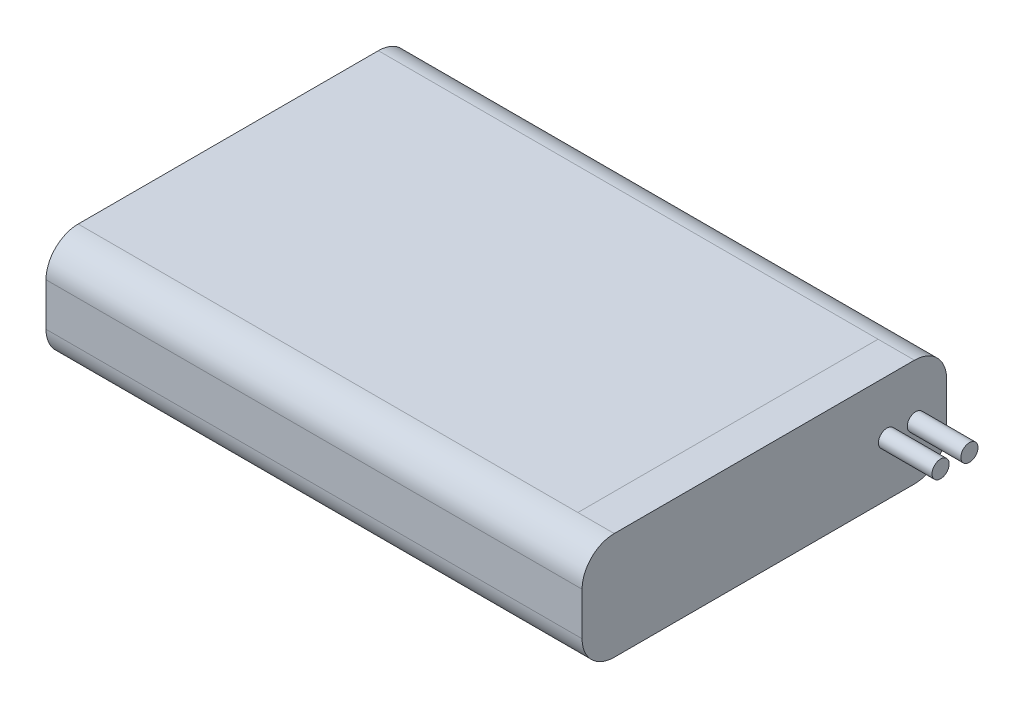
ISO-10303-21;
HEADER;
FILE_DESCRIPTION(('STEP AP214'),'2;1');
FILE_NAME('part.step','',(''),(''),'','','');
FILE_SCHEMA(('AUTOMOTIVE_DESIGN { 1 0 10303 214 1 1 1 1 }'));
ENDSEC;
DATA;
#1=APPLICATION_CONTEXT('core data for automotive mechanical design processes');
#2=APPLICATION_PROTOCOL_DEFINITION('international standard','automotive_design',2000,#1);
#3=PRODUCT_CONTEXT('',#1,'mechanical');
#4=PRODUCT('Part','Part','',(#3));
#5=PRODUCT_RELATED_PRODUCT_CATEGORY('part','',(#4));
#6=PRODUCT_DEFINITION_FORMATION('','',#4);
#7=PRODUCT_DEFINITION_CONTEXT('part definition',#1,'design');
#8=PRODUCT_DEFINITION('design','',#6,#7);
#9=PRODUCT_DEFINITION_SHAPE('','',#8);
#10=(LENGTH_UNIT() NAMED_UNIT(*) SI_UNIT(.MILLI.,.METRE.));
#11=(NAMED_UNIT(*) PLANE_ANGLE_UNIT() SI_UNIT($,.RADIAN.));
#12=(NAMED_UNIT(*) SI_UNIT($,.STERADIAN.) SOLID_ANGLE_UNIT());
#13=UNCERTAINTY_MEASURE_WITH_UNIT(LENGTH_MEASURE(1.E-05),#10,'distance_accuracy_value','');
#14=(GEOMETRIC_REPRESENTATION_CONTEXT(3) GLOBAL_UNCERTAINTY_ASSIGNED_CONTEXT((#13)) GLOBAL_UNIT_ASSIGNED_CONTEXT((#10,
#11,#12)) REPRESENTATION_CONTEXT('',''));
#15=CARTESIAN_POINT('',(0.,0.,0.));
#16=DIRECTION('',(0.,0.,1.));
#17=DIRECTION('',(1.,0.,0.));
#18=AXIS2_PLACEMENT_3D('',#15,#16,#17);
#19=CARTESIAN_POINT('',(50.,-5.28206765436695,13.8102105701798));
#20=DIRECTION('',(0.,1.,0.));
#21=DIRECTION('',(0.,0.,1.));
#22=AXIS2_PLACEMENT_3D('',#19,#20,#21);
#23=PLANE('',#22);
#24=DIRECTION('',(0.,0.,-1.));
#25=VECTOR('',#24,1.);
#26=CARTESIAN_POINT('',(46.6086278265007,-5.28206765436695,13.8102105701798));
#27=LINE('',#26,#25);
#28=CARTESIAN_POINT('',(46.6086278265007,-5.28206765436695,13.8102105701798));
#29=VERTEX_POINT('',#28);
#30=CARTESIAN_POINT('',(46.6086278265007,-5.28206765436695,-14.1897894298202));
#31=VERTEX_POINT('',#30);
#32=EDGE_CURVE('E395',#29,#31,#27,.T.);
#33=ORIENTED_EDGE('',*,*,#32,.F.);
#34=DIRECTION('',(-1.,0.,0.));
#35=VECTOR('',#34,1.);
#36=CARTESIAN_POINT('',(50.,-5.28206765436695,13.8102105701798));
#37=LINE('',#36,#35);
#38=CARTESIAN_POINT('',(0.,-5.28206765436695,13.8102105701798));
#39=VERTEX_POINT('',#38);
#40=EDGE_CURVE('E177',#29,#39,#37,.T.);
#41=ORIENTED_EDGE('',*,*,#40,.T.);
#42=DIRECTION('',(0.,0.,-1.));
#43=VECTOR('',#42,1.);
#44=CARTESIAN_POINT('',(0.,-5.28206765436695,13.8102105701798));
#45=LINE('',#44,#43);
#46=CARTESIAN_POINT('',(0.,-5.28206765436695,-14.1897894298202));
#47=VERTEX_POINT('',#46);
#48=EDGE_CURVE('E145',#39,#47,#45,.T.);
#49=ORIENTED_EDGE('',*,*,#48,.T.);
#50=DIRECTION('',(-1.,0.,0.));
#51=VECTOR('',#50,1.);
#52=CARTESIAN_POINT('',(50.,-5.28206765436695,-14.1897894298202));
#53=LINE('',#52,#51);
#54=EDGE_CURVE('E173',#31,#47,#53,.T.);
#55=ORIENTED_EDGE('',*,*,#54,.F.);
#56=EDGE_LOOP('',(#33,#41,#49,#55));
#57=FACE_BOUND('',#56,.T.);
#58=ADVANCED_FACE('F37',(#57),#23,.F.);
#59=CARTESIAN_POINT('',(50.,4.71793234563305,13.8102105701798));
#60=DIRECTION('',(0.,-1.,0.));
#61=DIRECTION('',(0.,0.,-1.));
#62=AXIS2_PLACEMENT_3D('',#59,#60,#61);
#63=PLANE('',#62);
#64=DIRECTION('',(0.,0.,1.));
#65=VECTOR('',#64,1.);
#66=CARTESIAN_POINT('',(46.6086278265007,4.71793234563305,-14.1897894298202));
#67=LINE('',#66,#65);
#68=CARTESIAN_POINT('',(46.6086278265007,4.71793234563305,-14.1897894298202));
#69=VERTEX_POINT('',#68);
#70=CARTESIAN_POINT('',(46.6086278265007,4.71793234563305,13.8102105701798));
#71=VERTEX_POINT('',#70);
#72=EDGE_CURVE('E370',#69,#71,#67,.T.);
#73=ORIENTED_EDGE('',*,*,#72,.F.);
#74=DIRECTION('',(-1.,0.,0.));
#75=VECTOR('',#74,1.);
#76=CARTESIAN_POINT('',(50.,4.71793234563305,-14.1897894298202));
#77=LINE('',#76,#75);
#78=CARTESIAN_POINT('',(0.,4.71793234563305,-14.1897894298202));
#79=VERTEX_POINT('',#78);
#80=EDGE_CURVE('E128',#69,#79,#77,.T.);
#81=ORIENTED_EDGE('',*,*,#80,.T.);
#82=DIRECTION('',(0.,0.,1.));
#83=VECTOR('',#82,1.);
#84=CARTESIAN_POINT('',(0.,4.71793234563305,13.8102105701798));
#85=LINE('',#84,#83);
#86=CARTESIAN_POINT('',(0.,4.71793234563305,13.8102105701798));
#87=VERTEX_POINT('',#86);
#88=EDGE_CURVE('E156',#79,#87,#85,.T.);
#89=ORIENTED_EDGE('',*,*,#88,.T.);
#90=DIRECTION('',(-1.,0.,0.));
#91=VECTOR('',#90,1.);
#92=CARTESIAN_POINT('',(50.,4.71793234563305,13.8102105701798));
#93=LINE('',#92,#91);
#94=EDGE_CURVE('E129',#71,#87,#93,.T.);
#95=ORIENTED_EDGE('',*,*,#94,.F.);
#96=EDGE_LOOP('',(#73,#81,#89,#95));
#97=FACE_BOUND('',#96,.T.);
#98=ADVANCED_FACE('F200',(#97),#63,.F.);
#99=CARTESIAN_POINT('',(50.,-2.28206765436695,13.8102105701798));
#100=DIRECTION('',(-1.,0.,0.));
#101=DIRECTION('',(0.,0.,1.));
#102=AXIS2_PLACEMENT_3D('',#99,#100,#101);
#103=CYLINDRICAL_SURFACE('',#102,3.);
#104=CARTESIAN_POINT('',(0.,-2.28206765436695,13.8102105701798));
#105=DIRECTION('',(1.,0.,0.));
#106=DIRECTION('',(0.,0.,1.));
#107=AXIS2_PLACEMENT_3D('',#104,#105,#106);
#108=CIRCLE('',#107,3.);
#109=CARTESIAN_POINT('',(0.,-2.28206765436693,16.8102105701798));
#110=VERTEX_POINT('',#109);
#111=EDGE_CURVE('E142',#110,#39,#108,.T.);
#112=ORIENTED_EDGE('',*,*,#111,.T.);
#113=ORIENTED_EDGE('',*,*,#40,.F.);
#114=CARTESIAN_POINT('',(50.,-5.28206765436695,13.8102105701798));
#115=VERTEX_POINT('',#114);
#116=EDGE_CURVE('E178',#115,#29,#37,.T.);
#117=ORIENTED_EDGE('',*,*,#116,.F.);
#118=CARTESIAN_POINT('',(50.,-2.28206765436695,13.8102105701798));
#119=DIRECTION('',(1.,0.,0.));
#120=DIRECTION('',(0.,0.,1.));
#121=AXIS2_PLACEMENT_3D('',#118,#119,#120);
#122=CIRCLE('',#121,3.);
#123=CARTESIAN_POINT('',(50.,-2.28206765436693,16.8102105701798));
#124=VERTEX_POINT('',#123);
#125=EDGE_CURVE('E161',#124,#115,#122,.T.);
#126=ORIENTED_EDGE('',*,*,#125,.F.);
#127=DIRECTION('',(-1.,0.,0.));
#128=VECTOR('',#127,1.);
#129=CARTESIAN_POINT('',(50.,-2.28206765436693,16.8102105701798));
#130=LINE('',#129,#128);
#131=EDGE_CURVE('E135',#124,#110,#130,.T.);
#132=ORIENTED_EDGE('',*,*,#131,.T.);
#133=EDGE_LOOP('',(#112,#113,#117,#126,#132));
#134=FACE_BOUND('',#133,.T.);
#135=ADVANCED_FACE('F39',(#134),#103,.T.);
#136=CARTESIAN_POINT('',(50.,-2.28206765436695,-14.1897894298202));
#137=DIRECTION('',(-1.,0.,0.));
#138=DIRECTION('',(0.,0.,1.));
#139=AXIS2_PLACEMENT_3D('',#136,#137,#138);
#140=CYLINDRICAL_SURFACE('',#139,3.);
#141=CARTESIAN_POINT('',(0.,-2.28206765436695,-14.1897894298202));
#142=DIRECTION('',(1.,0.,0.));
#143=DIRECTION('',(0.,0.,-1.));
#144=AXIS2_PLACEMENT_3D('',#141,#142,#143);
#145=CIRCLE('',#144,3.);
#146=CARTESIAN_POINT('',(0.,-2.28206765436695,-17.1897894298202));
#147=VERTEX_POINT('',#146);
#148=EDGE_CURVE('E149',#47,#147,#145,.T.);
#149=ORIENTED_EDGE('',*,*,#148,.T.);
#150=DIRECTION('',(-1.,0.,0.));
#151=VECTOR('',#150,1.);
#152=CARTESIAN_POINT('',(50.,-2.28206765436695,-17.1897894298202));
#153=LINE('',#152,#151);
#154=CARTESIAN_POINT('',(50.,-2.28206765436695,-17.1897894298202));
#155=VERTEX_POINT('',#154);
#156=EDGE_CURVE('E170',#155,#147,#153,.T.);
#157=ORIENTED_EDGE('',*,*,#156,.F.);
#158=CARTESIAN_POINT('',(50.,-2.28206765436695,-14.1897894298202));
#159=DIRECTION('',(1.,0.,0.));
#160=DIRECTION('',(0.,0.,-1.));
#161=AXIS2_PLACEMENT_3D('',#158,#159,#160);
#162=CIRCLE('',#161,3.);
#163=CARTESIAN_POINT('',(50.,-5.28206765436695,-14.1897894298202));
#164=VERTEX_POINT('',#163);
#165=EDGE_CURVE('E347',#164,#155,#162,.T.);
#166=ORIENTED_EDGE('',*,*,#165,.F.);
#167=EDGE_CURVE('E174',#164,#31,#53,.T.);
#168=ORIENTED_EDGE('',*,*,#167,.T.);
#169=ORIENTED_EDGE('',*,*,#54,.T.);
#170=EDGE_LOOP('',(#149,#157,#166,#168,#169));
#171=FACE_BOUND('',#170,.T.);
#172=ADVANCED_FACE('F209',(#171),#140,.T.);
#173=CARTESIAN_POINT('',(50.,-2.28206765436693,-17.1897894298202));
#174=DIRECTION('',(0.,0.,1.));
#175=DIRECTION('',(1.,0.,0.));
#176=AXIS2_PLACEMENT_3D('',#173,#174,#175);
#177=PLANE('',#176);
#178=DIRECTION('',(0.,1.,0.));
#179=VECTOR('',#178,1.);
#180=CARTESIAN_POINT('',(0.,-2.28206765436693,-17.1897894298202));
#181=LINE('',#180,#179);
#182=CARTESIAN_POINT('',(0.,1.71793234563303,-17.1897894298202));
#183=VERTEX_POINT('',#182);
#184=EDGE_CURVE('E151',#147,#183,#181,.T.);
#185=ORIENTED_EDGE('',*,*,#184,.T.);
#186=DIRECTION('',(-1.,0.,0.));
#187=VECTOR('',#186,1.);
#188=CARTESIAN_POINT('',(50.,1.71793234563303,-17.1897894298202));
#189=LINE('',#188,#187);
#190=CARTESIAN_POINT('',(50.,1.71793234563303,-17.1897894298202));
#191=VERTEX_POINT('',#190);
#192=EDGE_CURVE('E167',#191,#183,#189,.T.);
#193=ORIENTED_EDGE('',*,*,#192,.F.);
#194=DIRECTION('',(0.,1.,0.));
#195=VECTOR('',#194,1.);
#196=CARTESIAN_POINT('',(50.,-2.28206765436693,-17.1897894298202));
#197=LINE('',#196,#195);
#198=EDGE_CURVE('E138',#155,#191,#197,.T.);
#199=ORIENTED_EDGE('',*,*,#198,.F.);
#200=ORIENTED_EDGE('',*,*,#156,.T.);
#201=EDGE_LOOP('',(#185,#193,#199,#200));
#202=FACE_BOUND('',#201,.T.);
#203=ADVANCED_FACE('F212',(#202),#177,.F.);
#204=CARTESIAN_POINT('',(50.,1.71793234563305,-14.1897894298202));
#205=DIRECTION('',(-1.,0.,0.));
#206=DIRECTION('',(0.,0.,1.));
#207=AXIS2_PLACEMENT_3D('',#204,#205,#206);
#208=CYLINDRICAL_SURFACE('',#207,3.);
#209=CARTESIAN_POINT('',(0.,1.71793234563305,-14.1897894298202));
#210=DIRECTION('',(1.,0.,0.));
#211=DIRECTION('',(0.,0.,1.));
#212=AXIS2_PLACEMENT_3D('',#209,#210,#211);
#213=CIRCLE('',#212,3.);
#214=EDGE_CURVE('E153',#183,#79,#213,.T.);
#215=ORIENTED_EDGE('',*,*,#214,.T.);
#216=ORIENTED_EDGE('',*,*,#80,.F.);
#217=CARTESIAN_POINT('',(50.,4.71793234563305,-14.1897894298202));
#218=VERTEX_POINT('',#217);
#219=EDGE_CURVE('E164',#218,#69,#77,.T.);
#220=ORIENTED_EDGE('',*,*,#219,.F.);
#221=CARTESIAN_POINT('',(50.,1.71793234563305,-14.1897894298202));
#222=DIRECTION('',(1.,0.,0.));
#223=DIRECTION('',(0.,0.,1.));
#224=AXIS2_PLACEMENT_3D('',#221,#222,#223);
#225=CIRCLE('',#224,3.);
#226=EDGE_CURVE('E133',#191,#218,#225,.T.);
#227=ORIENTED_EDGE('',*,*,#226,.F.);
#228=ORIENTED_EDGE('',*,*,#192,.T.);
#229=EDGE_LOOP('',(#215,#216,#220,#227,#228));
#230=FACE_BOUND('',#229,.T.);
#231=ADVANCED_FACE('F216',(#230),#208,.T.);
#232=CARTESIAN_POINT('',(50.,1.71793234563305,13.8102105701798));
#233=DIRECTION('',(-1.,0.,0.));
#234=DIRECTION('',(0.,0.,1.));
#235=AXIS2_PLACEMENT_3D('',#232,#233,#234);
#236=CYLINDRICAL_SURFACE('',#235,3.);
#237=CARTESIAN_POINT('',(0.,1.71793234563305,13.8102105701798));
#238=DIRECTION('',(1.,0.,0.));
#239=DIRECTION('',(0.,0.,1.));
#240=AXIS2_PLACEMENT_3D('',#237,#238,#239);
#241=CIRCLE('',#240,3.);
#242=CARTESIAN_POINT('',(0.,1.71793234563303,16.8102105701798));
#243=VERTEX_POINT('',#242);
#244=EDGE_CURVE('E83',#87,#243,#241,.T.);
#245=ORIENTED_EDGE('',*,*,#244,.T.);
#246=DIRECTION('',(-1.,0.,0.));
#247=VECTOR('',#246,1.);
#248=CARTESIAN_POINT('',(50.,1.71793234563303,16.8102105701798));
#249=LINE('',#248,#247);
#250=CARTESIAN_POINT('',(50.,1.71793234563303,16.8102105701798));
#251=VERTEX_POINT('',#250);
#252=EDGE_CURVE('E132',#251,#243,#249,.T.);
#253=ORIENTED_EDGE('',*,*,#252,.F.);
#254=CARTESIAN_POINT('',(50.,1.71793234563305,13.8102105701798));
#255=DIRECTION('',(1.,0.,0.));
#256=DIRECTION('',(0.,0.,1.));
#257=AXIS2_PLACEMENT_3D('',#254,#255,#256);
#258=CIRCLE('',#257,3.);
#259=CARTESIAN_POINT('',(50.,4.71793234563305,13.8102105701798));
#260=VERTEX_POINT('',#259);
#261=EDGE_CURVE('E113',#260,#251,#258,.T.);
#262=ORIENTED_EDGE('',*,*,#261,.F.);
#263=EDGE_CURVE('E124',#260,#71,#93,.T.);
#264=ORIENTED_EDGE('',*,*,#263,.T.);
#265=ORIENTED_EDGE('',*,*,#94,.T.);
#266=EDGE_LOOP('',(#245,#253,#262,#264,#265));
#267=FACE_BOUND('',#266,.T.);
#268=ADVANCED_FACE('F131',(#267),#236,.T.);
#269=CARTESIAN_POINT('',(50.,-2.28206765436693,16.8102105701798));
#270=DIRECTION('',(0.,0.,-1.));
#271=DIRECTION('',(-1.,0.,0.));
#272=AXIS2_PLACEMENT_3D('',#269,#270,#271);
#273=PLANE('',#272);
#274=DIRECTION('',(0.,-1.,0.));
#275=VECTOR('',#274,1.);
#276=CARTESIAN_POINT('',(0.,-2.28206765436693,16.8102105701798));
#277=LINE('',#276,#275);
#278=EDGE_CURVE('E89',#243,#110,#277,.T.);
#279=ORIENTED_EDGE('',*,*,#278,.T.);
#280=ORIENTED_EDGE('',*,*,#131,.F.);
#281=DIRECTION('',(0.,-1.,0.));
#282=VECTOR('',#281,1.);
#283=CARTESIAN_POINT('',(50.,-2.28206765436693,16.8102105701798));
#284=LINE('',#283,#282);
#285=EDGE_CURVE('E54',#251,#124,#284,.T.);
#286=ORIENTED_EDGE('',*,*,#285,.F.);
#287=ORIENTED_EDGE('',*,*,#252,.T.);
#288=EDGE_LOOP('',(#279,#280,#286,#287));
#289=FACE_BOUND('',#288,.T.);
#290=ADVANCED_FACE('F187',(#289),#273,.F.);
#291=CARTESIAN_POINT('',(50.,-2.28206765436695,13.8102105701798));
#292=DIRECTION('',(-1.,0.,0.));
#293=DIRECTION('',(0.,0.,1.));
#294=AXIS2_PLACEMENT_3D('',#291,#292,#293);
#295=PLANE('',#294);
#296=CARTESIAN_POINT('',(50.,-0.301594572683894,-14.3177603057034));
#297=DIRECTION('',(-1.,0.,0.));
#298=DIRECTION('',(0.,0.,1.));
#299=AXIS2_PLACEMENT_3D('',#296,#297,#298);
#300=CIRCLE('',#299,0.800000000000001);
#301=CARTESIAN_POINT('',(50.,-0.301594572683894,-13.5177603057034));
#302=VERTEX_POINT('',#301);
#303=EDGE_CURVE('E11',#302,#302,#300,.F.);
#304=ORIENTED_EDGE('',*,*,#303,.F.);
#305=EDGE_LOOP('',(#304));
#306=FACE_BOUND('',#305,.T.);
#307=CARTESIAN_POINT('',(50.,-0.2829227585867,-11.6289058560285));
#308=DIRECTION('',(-1.,0.,0.));
#309=DIRECTION('',(0.,0.,1.));
#310=AXIS2_PLACEMENT_3D('',#307,#308,#309);
#311=CIRCLE('',#310,0.800000000000001);
#312=CARTESIAN_POINT('',(50.,-0.2829227585867,-10.8289058560285));
#313=VERTEX_POINT('',#312);
#314=EDGE_CURVE('E46',#313,#313,#311,.F.);
#315=ORIENTED_EDGE('',*,*,#314,.F.);
#316=EDGE_LOOP('',(#315));
#317=FACE_BOUND('',#316,.T.);
#318=ORIENTED_EDGE('',*,*,#125,.T.);
#319=DIRECTION('',(0.,1.,0.));
#320=VECTOR('',#319,1.);
#321=CARTESIAN_POINT('',(50.,-5.28216765436695,13.8102105701798));
#322=LINE('',#321,#320);
#323=CARTESIAN_POINT('',(50.,-5.28216765436695,13.8102105701798));
#324=VERTEX_POINT('',#323);
#325=EDGE_CURVE('E374',#324,#115,#322,.T.);
#326=ORIENTED_EDGE('',*,*,#325,.F.);
#327=DIRECTION('',(0.,0.,1.));
#328=VECTOR('',#327,1.);
#329=CARTESIAN_POINT('',(50.,-5.28216765436695,13.8102105701798));
#330=LINE('',#329,#328);
#331=CARTESIAN_POINT('',(50.,-5.28216765436695,-14.1897894298202));
#332=VERTEX_POINT('',#331);
#333=EDGE_CURVE('E398',#332,#324,#330,.T.);
#334=ORIENTED_EDGE('',*,*,#333,.F.);
#335=DIRECTION('',(0.,1.,0.));
#336=VECTOR('',#335,1.);
#337=CARTESIAN_POINT('',(50.,-5.28216765436695,-14.1897894298202));
#338=LINE('',#337,#336);
#339=EDGE_CURVE('E97',#332,#164,#338,.T.);
#340=ORIENTED_EDGE('',*,*,#339,.T.);
#341=ORIENTED_EDGE('',*,*,#165,.T.);
#342=ORIENTED_EDGE('',*,*,#198,.T.);
#343=ORIENTED_EDGE('',*,*,#226,.T.);
#344=DIRECTION('',(0.,-1.,0.));
#345=VECTOR('',#344,1.);
#346=CARTESIAN_POINT('',(50.,4.71803234563305,-14.1897894298202));
#347=LINE('',#346,#345);
#348=CARTESIAN_POINT('',(50.,4.71803234563305,-14.1897894298202));
#349=VERTEX_POINT('',#348);
#350=EDGE_CURVE('E342',#349,#218,#347,.T.);
#351=ORIENTED_EDGE('',*,*,#350,.F.);
#352=DIRECTION('',(0.,0.,-1.));
#353=VECTOR('',#352,1.);
#354=CARTESIAN_POINT('',(50.,4.71803234563305,-14.1897894298202));
#355=LINE('',#354,#353);
#356=CARTESIAN_POINT('',(50.,4.71803234563305,13.8102105701798));
#357=VERTEX_POINT('',#356);
#358=EDGE_CURVE('E116',#357,#349,#355,.T.);
#359=ORIENTED_EDGE('',*,*,#358,.F.);
#360=DIRECTION('',(0.,-1.,0.));
#361=VECTOR('',#360,1.);
#362=CARTESIAN_POINT('',(50.,4.71803234563305,13.8102105701798));
#363=LINE('',#362,#361);
#364=EDGE_CURVE('E109',#357,#260,#363,.T.);
#365=ORIENTED_EDGE('',*,*,#364,.T.);
#366=ORIENTED_EDGE('',*,*,#261,.T.);
#367=ORIENTED_EDGE('',*,*,#285,.T.);
#368=EDGE_LOOP('',(#318,#326,#334,#340,#341,#342,#343,#351,#359,#365,#366,#367));
#369=FACE_BOUND('',#368,.T.);
#370=ADVANCED_FACE('F111',(#306,#317,#369),#295,.F.);
#371=CARTESIAN_POINT('',(0.,-2.28206765436695,13.8102105701798));
#372=DIRECTION('',(-1.,0.,0.));
#373=DIRECTION('',(0.,0.,1.));
#374=AXIS2_PLACEMENT_3D('',#371,#372,#373);
#375=PLANE('',#374);
#376=ORIENTED_EDGE('',*,*,#111,.F.);
#377=ORIENTED_EDGE('',*,*,#278,.F.);
#378=ORIENTED_EDGE('',*,*,#244,.F.);
#379=ORIENTED_EDGE('',*,*,#88,.F.);
#380=ORIENTED_EDGE('',*,*,#214,.F.);
#381=ORIENTED_EDGE('',*,*,#184,.F.);
#382=ORIENTED_EDGE('',*,*,#148,.F.);
#383=ORIENTED_EDGE('',*,*,#48,.F.);
#384=EDGE_LOOP('',(#376,#377,#378,#379,#380,#381,#382,#383));
#385=FACE_BOUND('',#384,.T.);
#386=ADVANCED_FACE('F186',(#385),#375,.T.);
#387=CARTESIAN_POINT('',(55.,-0.2829227585867,-11.6289058560285));
#388=DIRECTION('',(-1.,0.,0.));
#389=DIRECTION('',(0.,0.,1.));
#390=AXIS2_PLACEMENT_3D('',#387,#388,#389);
#391=CYLINDRICAL_SURFACE('',#390,0.800000000000001);
#392=CARTESIAN_POINT('',(55.,-0.2829227585867,-11.6289058560285));
#393=DIRECTION('',(1.,0.,0.));
#394=DIRECTION('',(0.,0.,-1.));
#395=AXIS2_PLACEMENT_3D('',#392,#393,#394);
#396=CIRCLE('',#395,0.800000000000001);
#397=CARTESIAN_POINT('',(55.,-0.2829227585867,-12.4289058560285));
#398=VERTEX_POINT('',#397);
#399=EDGE_CURVE('E146',#398,#398,#396,.T.);
#400=ORIENTED_EDGE('',*,*,#399,.F.);
#401=EDGE_LOOP('',(#400));
#402=FACE_BOUND('',#401,.T.);
#403=ORIENTED_EDGE('',*,*,#314,.T.);
#404=EDGE_LOOP('',(#403));
#405=FACE_BOUND('',#404,.T.);
#406=ADVANCED_FACE('F183',(#402,#405),#391,.T.);
#407=CARTESIAN_POINT('',(55.,-0.2829227585867,-11.6289058560285));
#408=DIRECTION('',(1.,0.,0.));
#409=DIRECTION('',(0.,0.,-1.));
#410=AXIS2_PLACEMENT_3D('',#407,#408,#409);
#411=PLANE('',#410);
#412=ORIENTED_EDGE('',*,*,#399,.T.);
#413=EDGE_LOOP('',(#412));
#414=FACE_BOUND('',#413,.T.);
#415=ADVANCED_FACE('F329',(#414),#411,.T.);
#416=CARTESIAN_POINT('',(55.,-0.301594572683894,-14.3177603057034));
#417=DIRECTION('',(-1.,0.,0.));
#418=DIRECTION('',(0.,0.,1.));
#419=AXIS2_PLACEMENT_3D('',#416,#417,#418);
#420=CYLINDRICAL_SURFACE('',#419,0.800000000000001);
#421=CARTESIAN_POINT('',(55.,-0.301594572683894,-14.3177603057034));
#422=DIRECTION('',(1.,0.,0.));
#423=DIRECTION('',(0.,0.,-1.));
#424=AXIS2_PLACEMENT_3D('',#421,#422,#423);
#425=CIRCLE('',#424,0.800000000000001);
#426=CARTESIAN_POINT('',(55.,-0.301594572683894,-15.1177603057034));
#427=VERTEX_POINT('',#426);
#428=EDGE_CURVE('E339',#427,#427,#425,.T.);
#429=ORIENTED_EDGE('',*,*,#428,.F.);
#430=EDGE_LOOP('',(#429));
#431=FACE_BOUND('',#430,.T.);
#432=ORIENTED_EDGE('',*,*,#303,.T.);
#433=EDGE_LOOP('',(#432));
#434=FACE_BOUND('',#433,.T.);
#435=ADVANCED_FACE('F325',(#431,#434),#420,.T.);
#436=CARTESIAN_POINT('',(55.,-0.301594572683894,-14.3177603057034));
#437=DIRECTION('',(1.,0.,0.));
#438=DIRECTION('',(0.,0.,-1.));
#439=AXIS2_PLACEMENT_3D('',#436,#437,#438);
#440=PLANE('',#439);
#441=ORIENTED_EDGE('',*,*,#428,.T.);
#442=EDGE_LOOP('',(#441));
#443=FACE_BOUND('',#442,.T.);
#444=ADVANCED_FACE('F321',(#443),#440,.T.);
#445=CARTESIAN_POINT('',(50.,4.71803234563305,-14.1897894298202));
#446=DIRECTION('',(0.,0.,1.));
#447=DIRECTION('',(1.,0.,0.));
#448=AXIS2_PLACEMENT_3D('',#445,#446,#447);
#449=PLANE('',#448);
#450=ORIENTED_EDGE('',*,*,#219,.T.);
#451=DIRECTION('',(0.,-1.,0.));
#452=VECTOR('',#451,1.);
#453=CARTESIAN_POINT('',(46.6086278265007,4.71803234563305,-14.1897894298202));
#454=LINE('',#453,#452);
#455=CARTESIAN_POINT('',(46.6086278265007,4.71803234563305,-14.1897894298202));
#456=VERTEX_POINT('',#455);
#457=EDGE_CURVE('E366',#456,#69,#454,.T.);
#458=ORIENTED_EDGE('',*,*,#457,.F.);
#459=DIRECTION('',(-1.,0.,0.));
#460=VECTOR('',#459,1.);
#461=CARTESIAN_POINT('',(50.,4.71803234563305,-14.1897894298202));
#462=LINE('',#461,#460);
#463=EDGE_CURVE('E376',#349,#456,#462,.T.);
#464=ORIENTED_EDGE('',*,*,#463,.F.);
#465=ORIENTED_EDGE('',*,*,#350,.T.);
#466=EDGE_LOOP('',(#450,#458,#464,#465));
#467=FACE_BOUND('',#466,.T.);
#468=ADVANCED_FACE('F317',(#467),#449,.F.);
#469=CARTESIAN_POINT('',(46.6086278265007,4.71803234563305,-14.1897894298202));
#470=DIRECTION('',(1.,0.,0.));
#471=DIRECTION('',(0.,0.,-1.));
#472=AXIS2_PLACEMENT_3D('',#469,#470,#471);
#473=PLANE('',#472);
#474=ORIENTED_EDGE('',*,*,#72,.T.);
#475=DIRECTION('',(0.,-1.,0.));
#476=VECTOR('',#475,1.);
#477=CARTESIAN_POINT('',(46.6086278265007,4.71803234563305,13.8102105701798));
#478=LINE('',#477,#476);
#479=CARTESIAN_POINT('',(46.6086278265007,4.71803234563305,13.8102105701798));
#480=VERTEX_POINT('',#479);
#481=EDGE_CURVE('E119',#480,#71,#478,.T.);
#482=ORIENTED_EDGE('',*,*,#481,.F.);
#483=DIRECTION('',(0.,0.,1.));
#484=VECTOR('',#483,1.);
#485=CARTESIAN_POINT('',(46.6086278265007,4.71803234563305,-14.1897894298202));
#486=LINE('',#485,#484);
#487=EDGE_CURVE('E372',#456,#480,#486,.T.);
#488=ORIENTED_EDGE('',*,*,#487,.F.);
#489=ORIENTED_EDGE('',*,*,#457,.T.);
#490=EDGE_LOOP('',(#474,#482,#488,#489));
#491=FACE_BOUND('',#490,.T.);
#492=ADVANCED_FACE('F314',(#491),#473,.F.);
#493=CARTESIAN_POINT('',(50.,4.71803234563305,13.8102105701798));
#494=DIRECTION('',(0.,0.,-1.));
#495=DIRECTION('',(-1.,0.,0.));
#496=AXIS2_PLACEMENT_3D('',#493,#494,#495);
#497=PLANE('',#496);
#498=ORIENTED_EDGE('',*,*,#263,.F.);
#499=ORIENTED_EDGE('',*,*,#364,.F.);
#500=DIRECTION('',(1.,0.,0.));
#501=VECTOR('',#500,1.);
#502=CARTESIAN_POINT('',(50.,4.71803234563305,13.8102105701798));
#503=LINE('',#502,#501);
#504=EDGE_CURVE('E120',#480,#357,#503,.T.);
#505=ORIENTED_EDGE('',*,*,#504,.F.);
#506=ORIENTED_EDGE('',*,*,#481,.T.);
#507=EDGE_LOOP('',(#498,#499,#505,#506));
#508=FACE_BOUND('',#507,.T.);
#509=ADVANCED_FACE('F125',(#508),#497,.F.);
#510=CARTESIAN_POINT('',(0.,4.71803234563305,0.));
#511=DIRECTION('',(0.,-1.,0.));
#512=DIRECTION('',(0.,0.,-1.));
#513=AXIS2_PLACEMENT_3D('',#510,#511,#512);
#514=PLANE('',#513);
#515=ORIENTED_EDGE('',*,*,#358,.T.);
#516=ORIENTED_EDGE('',*,*,#463,.T.);
#517=ORIENTED_EDGE('',*,*,#487,.T.);
#518=ORIENTED_EDGE('',*,*,#504,.T.);
#519=EDGE_LOOP('',(#515,#516,#517,#518));
#520=FACE_BOUND('',#519,.T.);
#521=ADVANCED_FACE('F248',(#520),#514,.F.);
#522=CARTESIAN_POINT('',(50.,-5.28216765436695,13.8102105701798));
#523=DIRECTION('',(0.,0.,-1.));
#524=DIRECTION('',(-1.,0.,0.));
#525=AXIS2_PLACEMENT_3D('',#522,#523,#524);
#526=PLANE('',#525);
#527=ORIENTED_EDGE('',*,*,#116,.T.);
#528=DIRECTION('',(0.,1.,0.));
#529=VECTOR('',#528,1.);
#530=CARTESIAN_POINT('',(46.6086278265007,-5.28216765436695,13.8102105701798));
#531=LINE('',#530,#529);
#532=CARTESIAN_POINT('',(46.6086278265007,-5.28216765436695,13.8102105701798));
#533=VERTEX_POINT('',#532);
#534=EDGE_CURVE('E379',#533,#29,#531,.T.);
#535=ORIENTED_EDGE('',*,*,#534,.F.);
#536=DIRECTION('',(-1.,0.,0.));
#537=VECTOR('',#536,1.);
#538=CARTESIAN_POINT('',(50.,-5.28216765436695,13.8102105701798));
#539=LINE('',#538,#537);
#540=EDGE_CURVE('E404',#324,#533,#539,.T.);
#541=ORIENTED_EDGE('',*,*,#540,.F.);
#542=ORIENTED_EDGE('',*,*,#325,.T.);
#543=EDGE_LOOP('',(#527,#535,#541,#542));
#544=FACE_BOUND('',#543,.T.);
#545=ADVANCED_FACE('F253',(#544),#526,.F.);
#546=CARTESIAN_POINT('',(46.6086278265007,-5.28216765436695,13.8102105701798));
#547=DIRECTION('',(1.,0.,0.));
#548=DIRECTION('',(0.,0.,-1.));
#549=AXIS2_PLACEMENT_3D('',#546,#547,#548);
#550=PLANE('',#549);
#551=ORIENTED_EDGE('',*,*,#32,.T.);
#552=DIRECTION('',(0.,1.,0.));
#553=VECTOR('',#552,1.);
#554=CARTESIAN_POINT('',(46.6086278265007,-5.28216765436695,-14.1897894298202));
#555=LINE('',#554,#553);
#556=CARTESIAN_POINT('',(46.6086278265007,-5.28216765436695,-14.1897894298202));
#557=VERTEX_POINT('',#556);
#558=EDGE_CURVE('E390',#557,#31,#555,.T.);
#559=ORIENTED_EDGE('',*,*,#558,.F.);
#560=DIRECTION('',(0.,0.,-1.));
#561=VECTOR('',#560,1.);
#562=CARTESIAN_POINT('',(46.6086278265007,-5.28216765436695,13.8102105701798));
#563=LINE('',#562,#561);
#564=EDGE_CURVE('E401',#533,#557,#563,.T.);
#565=ORIENTED_EDGE('',*,*,#564,.F.);
#566=ORIENTED_EDGE('',*,*,#534,.T.);
#567=EDGE_LOOP('',(#551,#559,#565,#566));
#568=FACE_BOUND('',#567,.T.);
#569=ADVANCED_FACE('F289',(#568),#550,.F.);
#570=CARTESIAN_POINT('',(50.,-5.28216765436695,-14.1897894298202));
#571=DIRECTION('',(0.,0.,1.));
#572=DIRECTION('',(1.,0.,0.));
#573=AXIS2_PLACEMENT_3D('',#570,#571,#572);
#574=PLANE('',#573);
#575=ORIENTED_EDGE('',*,*,#167,.F.);
#576=ORIENTED_EDGE('',*,*,#339,.F.);
#577=DIRECTION('',(1.,0.,0.));
#578=VECTOR('',#577,1.);
#579=CARTESIAN_POINT('',(50.,-5.28216765436695,-14.1897894298202));
#580=LINE('',#579,#578);
#581=EDGE_CURVE('E394',#557,#332,#580,.T.);
#582=ORIENTED_EDGE('',*,*,#581,.F.);
#583=ORIENTED_EDGE('',*,*,#558,.T.);
#584=EDGE_LOOP('',(#575,#576,#582,#583));
#585=FACE_BOUND('',#584,.T.);
#586=ADVANCED_FACE('F266',(#585),#574,.F.);
#587=CARTESIAN_POINT('',(0.,-5.28216765436695,0.));
#588=DIRECTION('',(0.,1.,0.));
#589=DIRECTION('',(0.,0.,1.));
#590=AXIS2_PLACEMENT_3D('',#587,#588,#589);
#591=PLANE('',#590);
#592=ORIENTED_EDGE('',*,*,#333,.T.);
#593=ORIENTED_EDGE('',*,*,#540,.T.);
#594=ORIENTED_EDGE('',*,*,#564,.T.);
#595=ORIENTED_EDGE('',*,*,#581,.T.);
#596=EDGE_LOOP('',(#592,#593,#594,#595));
#597=FACE_BOUND('',#596,.T.);
#598=ADVANCED_FACE('F262',(#597),#591,.F.);
#599=CLOSED_SHELL('',(#58,#98,#135,#172,#203,#231,#268,#290,#370,#386,#406,#415,#435,#444,#468,
#492,#509,#521,#545,#569,#586,#598));
#600=MANIFOLD_SOLID_BREP('B2',#599);
#601=ADVANCED_BREP_SHAPE_REPRESENTATION('',(#18,#600),#14);
#602=SHAPE_DEFINITION_REPRESENTATION(#9,#601);
ENDSEC;
END-ISO-10303-21;
